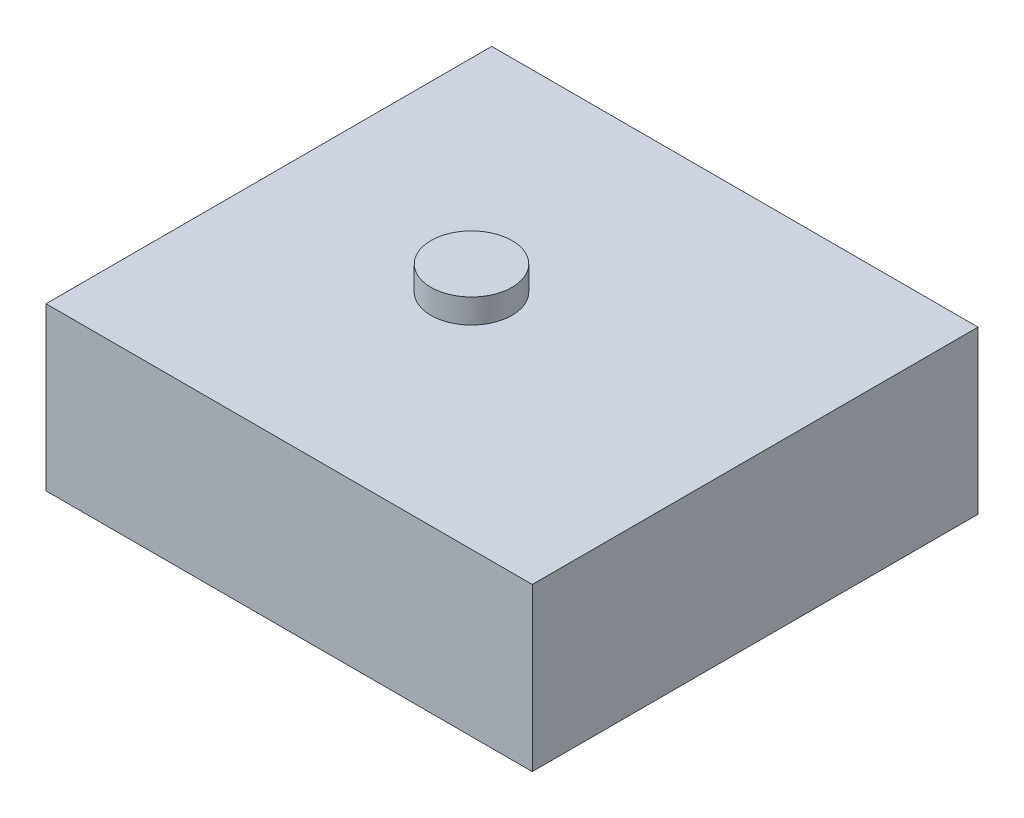
ISO-10303-21;
HEADER;
FILE_DESCRIPTION(('STEP AP214'),'2;1');
FILE_NAME('part.step','',(''),(''),'','','');
FILE_SCHEMA(('AUTOMOTIVE_DESIGN { 1 0 10303 214 1 1 1 1 }'));
ENDSEC;
DATA;
#1=APPLICATION_CONTEXT('core data for automotive mechanical design processes');
#2=APPLICATION_PROTOCOL_DEFINITION('international standard','automotive_design',2000,#1);
#3=PRODUCT_CONTEXT('',#1,'mechanical');
#4=PRODUCT('Part','Part','',(#3));
#5=PRODUCT_RELATED_PRODUCT_CATEGORY('part','',(#4));
#6=PRODUCT_DEFINITION_FORMATION('','',#4);
#7=PRODUCT_DEFINITION_CONTEXT('part definition',#1,'design');
#8=PRODUCT_DEFINITION('design','',#6,#7);
#9=PRODUCT_DEFINITION_SHAPE('','',#8);
#10=(LENGTH_UNIT() NAMED_UNIT(*) SI_UNIT(.MILLI.,.METRE.));
#11=(NAMED_UNIT(*) PLANE_ANGLE_UNIT() SI_UNIT($,.RADIAN.));
#12=(NAMED_UNIT(*) SI_UNIT($,.STERADIAN.) SOLID_ANGLE_UNIT());
#13=UNCERTAINTY_MEASURE_WITH_UNIT(LENGTH_MEASURE(1.E-05),#10,'distance_accuracy_value','');
#14=(GEOMETRIC_REPRESENTATION_CONTEXT(3) GLOBAL_UNCERTAINTY_ASSIGNED_CONTEXT((#13)) GLOBAL_UNIT_ASSIGNED_CONTEXT((#10,
#11,#12)) REPRESENTATION_CONTEXT('',''));
#15=CARTESIAN_POINT('',(0.,0.,0.));
#16=DIRECTION('',(0.,0.,1.));
#17=DIRECTION('',(1.,0.,0.));
#18=AXIS2_PLACEMENT_3D('',#15,#16,#17);
#19=CARTESIAN_POINT('',(60.,40.,-55.));
#20=DIRECTION('',(-1.,0.,0.));
#21=DIRECTION('',(0.,0.,1.));
#22=AXIS2_PLACEMENT_3D('',#19,#20,#21);
#23=PLANE('',#22);
#24=DIRECTION('',(0.,0.,-1.));
#25=VECTOR('',#24,1.);
#26=CARTESIAN_POINT('',(60.,0.,-55.));
#27=LINE('',#26,#25);
#28=CARTESIAN_POINT('',(60.,0.,55.));
#29=VERTEX_POINT('',#28);
#30=CARTESIAN_POINT('',(60.,0.,-55.));
#31=VERTEX_POINT('',#30);
#32=EDGE_CURVE('E100',#29,#31,#27,.T.);
#33=ORIENTED_EDGE('',*,*,#32,.T.);
#34=DIRECTION('',(0.,-1.,0.));
#35=VECTOR('',#34,1.);
#36=CARTESIAN_POINT('',(60.,40.,-55.));
#37=LINE('',#36,#35);
#38=CARTESIAN_POINT('',(60.,40.,-55.));
#39=VERTEX_POINT('',#38);
#40=EDGE_CURVE('E11',#39,#31,#37,.T.);
#41=ORIENTED_EDGE('',*,*,#40,.F.);
#42=DIRECTION('',(0.,0.,-1.));
#43=VECTOR('',#42,1.);
#44=CARTESIAN_POINT('',(60.,40.,-55.));
#45=LINE('',#44,#43);
#46=CARTESIAN_POINT('',(60.,40.,55.));
#47=VERTEX_POINT('',#46);
#48=EDGE_CURVE('E88',#47,#39,#45,.T.);
#49=ORIENTED_EDGE('',*,*,#48,.F.);
#50=DIRECTION('',(0.,-1.,0.));
#51=VECTOR('',#50,1.);
#52=CARTESIAN_POINT('',(60.,40.,55.));
#53=LINE('',#52,#51);
#54=EDGE_CURVE('E96',#47,#29,#53,.T.);
#55=ORIENTED_EDGE('',*,*,#54,.T.);
#56=EDGE_LOOP('',(#33,#41,#49,#55));
#57=FACE_BOUND('',#56,.T.);
#58=ADVANCED_FACE('F37',(#57),#23,.F.);
#59=CARTESIAN_POINT('',(-60.,40.,-55.));
#60=DIRECTION('',(0.,0.,1.));
#61=DIRECTION('',(1.,0.,0.));
#62=AXIS2_PLACEMENT_3D('',#59,#60,#61);
#63=PLANE('',#62);
#64=DIRECTION('',(-1.,0.,0.));
#65=VECTOR('',#64,1.);
#66=CARTESIAN_POINT('',(-60.,0.,-55.));
#67=LINE('',#66,#65);
#68=CARTESIAN_POINT('',(-60.,0.,-55.));
#69=VERTEX_POINT('',#68);
#70=EDGE_CURVE('E92',#31,#69,#67,.T.);
#71=ORIENTED_EDGE('',*,*,#70,.T.);
#72=DIRECTION('',(0.,-1.,0.));
#73=VECTOR('',#72,1.);
#74=CARTESIAN_POINT('',(-60.,40.,-55.));
#75=LINE('',#74,#73);
#76=CARTESIAN_POINT('',(-60.,40.,-55.));
#77=VERTEX_POINT('',#76);
#78=EDGE_CURVE('E45',#77,#69,#75,.T.);
#79=ORIENTED_EDGE('',*,*,#78,.F.);
#80=DIRECTION('',(-1.,0.,0.));
#81=VECTOR('',#80,1.);
#82=CARTESIAN_POINT('',(-60.,40.,-55.));
#83=LINE('',#82,#81);
#84=EDGE_CURVE('E83',#39,#77,#83,.T.);
#85=ORIENTED_EDGE('',*,*,#84,.F.);
#86=ORIENTED_EDGE('',*,*,#40,.T.);
#87=EDGE_LOOP('',(#71,#79,#85,#86));
#88=FACE_BOUND('',#87,.T.);
#89=ADVANCED_FACE('F91',(#88),#63,.F.);
#90=CARTESIAN_POINT('',(-60.,40.,-55.));
#91=DIRECTION('',(1.,0.,0.));
#92=DIRECTION('',(0.,0.,-1.));
#93=AXIS2_PLACEMENT_3D('',#90,#91,#92);
#94=PLANE('',#93);
#95=DIRECTION('',(0.,0.,1.));
#96=VECTOR('',#95,1.);
#97=CARTESIAN_POINT('',(-60.,0.,-55.));
#98=LINE('',#97,#96);
#99=CARTESIAN_POINT('',(-60.,0.,55.));
#100=VERTEX_POINT('',#99);
#101=EDGE_CURVE('E70',#69,#100,#98,.T.);
#102=ORIENTED_EDGE('',*,*,#101,.T.);
#103=DIRECTION('',(0.,-1.,0.));
#104=VECTOR('',#103,1.);
#105=CARTESIAN_POINT('',(-60.,40.,55.));
#106=LINE('',#105,#104);
#107=CARTESIAN_POINT('',(-60.,40.,55.));
#108=VERTEX_POINT('',#107);
#109=EDGE_CURVE('E93',#108,#100,#106,.T.);
#110=ORIENTED_EDGE('',*,*,#109,.F.);
#111=DIRECTION('',(0.,0.,1.));
#112=VECTOR('',#111,1.);
#113=CARTESIAN_POINT('',(-60.,40.,-55.));
#114=LINE('',#113,#112);
#115=EDGE_CURVE('E86',#77,#108,#114,.T.);
#116=ORIENTED_EDGE('',*,*,#115,.F.);
#117=ORIENTED_EDGE('',*,*,#78,.T.);
#118=EDGE_LOOP('',(#102,#110,#116,#117));
#119=FACE_BOUND('',#118,.T.);
#120=ADVANCED_FACE('F94',(#119),#94,.F.);
#121=CARTESIAN_POINT('',(-60.,40.,55.));
#122=DIRECTION('',(0.,0.,-1.));
#123=DIRECTION('',(-1.,0.,0.));
#124=AXIS2_PLACEMENT_3D('',#121,#122,#123);
#125=PLANE('',#124);
#126=DIRECTION('',(1.,0.,0.));
#127=VECTOR('',#126,1.);
#128=CARTESIAN_POINT('',(-60.,0.,55.));
#129=LINE('',#128,#127);
#130=EDGE_CURVE('E76',#100,#29,#129,.T.);
#131=ORIENTED_EDGE('',*,*,#130,.T.);
#132=ORIENTED_EDGE('',*,*,#54,.F.);
#133=DIRECTION('',(1.,0.,0.));
#134=VECTOR('',#133,1.);
#135=CARTESIAN_POINT('',(-60.,40.,55.));
#136=LINE('',#135,#134);
#137=EDGE_CURVE('E53',#108,#47,#136,.T.);
#138=ORIENTED_EDGE('',*,*,#137,.F.);
#139=ORIENTED_EDGE('',*,*,#109,.T.);
#140=EDGE_LOOP('',(#131,#132,#138,#139));
#141=FACE_BOUND('',#140,.T.);
#142=ADVANCED_FACE('F108',(#141),#125,.F.);
#143=CARTESIAN_POINT('',(0.,40.,0.));
#144=DIRECTION('',(0.,1.,0.));
#145=DIRECTION('',(0.,0.,1.));
#146=AXIS2_PLACEMENT_3D('',#143,#144,#145);
#147=PLANE('',#146);
#148=CARTESIAN_POINT('',(-10.,40.,0.));
#149=DIRECTION('',(0.,1.,0.));
#150=DIRECTION('',(0.,0.,1.));
#151=AXIS2_PLACEMENT_3D('',#148,#149,#150);
#152=CIRCLE('',#151,10.);
#153=CARTESIAN_POINT('',(-10.,40.,10.));
#154=VERTEX_POINT('',#153);
#155=EDGE_CURVE('E114',#154,#154,#152,.T.);
#156=ORIENTED_EDGE('',*,*,#155,.F.);
#157=EDGE_LOOP('',(#156));
#158=FACE_BOUND('',#157,.T.);
#159=ORIENTED_EDGE('',*,*,#48,.T.);
#160=ORIENTED_EDGE('',*,*,#84,.T.);
#161=ORIENTED_EDGE('',*,*,#115,.T.);
#162=ORIENTED_EDGE('',*,*,#137,.T.);
#163=EDGE_LOOP('',(#159,#160,#161,#162));
#164=FACE_BOUND('',#163,.T.);
#165=ADVANCED_FACE('F84',(#158,#164),#147,.T.);
#166=CARTESIAN_POINT('',(0.,0.,0.));
#167=DIRECTION('',(0.,1.,0.));
#168=DIRECTION('',(0.,0.,1.));
#169=AXIS2_PLACEMENT_3D('',#166,#167,#168);
#170=PLANE('',#169);
#171=ORIENTED_EDGE('',*,*,#32,.F.);
#172=ORIENTED_EDGE('',*,*,#130,.F.);
#173=ORIENTED_EDGE('',*,*,#101,.F.);
#174=ORIENTED_EDGE('',*,*,#70,.F.);
#175=EDGE_LOOP('',(#171,#172,#173,#174));
#176=FACE_BOUND('',#175,.T.);
#177=ADVANCED_FACE('F111',(#176),#170,.F.);
#178=CARTESIAN_POINT('',(-10.,46.,0.));
#179=DIRECTION('',(0.,-1.,0.));
#180=DIRECTION('',(0.,0.,-1.));
#181=AXIS2_PLACEMENT_3D('',#178,#179,#180);
#182=CYLINDRICAL_SURFACE('',#181,10.);
#183=CARTESIAN_POINT('',(-10.,46.,0.));
#184=DIRECTION('',(0.,1.,0.));
#185=DIRECTION('',(0.,0.,1.));
#186=AXIS2_PLACEMENT_3D('',#183,#184,#185);
#187=CIRCLE('',#186,10.);
#188=CARTESIAN_POINT('',(-10.,46.,10.));
#189=VERTEX_POINT('',#188);
#190=EDGE_CURVE('E103',#189,#189,#187,.T.);
#191=ORIENTED_EDGE('',*,*,#190,.F.);
#192=EDGE_LOOP('',(#191));
#193=FACE_BOUND('',#192,.T.);
#194=ORIENTED_EDGE('',*,*,#155,.T.);
#195=EDGE_LOOP('',(#194));
#196=FACE_BOUND('',#195,.T.);
#197=ADVANCED_FACE('F122',(#193,#196),#182,.T.);
#198=CARTESIAN_POINT('',(-10.,46.,0.));
#199=DIRECTION('',(0.,1.,0.));
#200=DIRECTION('',(0.,0.,1.));
#201=AXIS2_PLACEMENT_3D('',#198,#199,#200);
#202=PLANE('',#201);
#203=ORIENTED_EDGE('',*,*,#190,.T.);
#204=EDGE_LOOP('',(#203));
#205=FACE_BOUND('',#204,.T.);
#206=ADVANCED_FACE('F120',(#205),#202,.T.);
#207=CLOSED_SHELL('',(#58,#89,#120,#142,#165,#177,#197,#206));
#208=MANIFOLD_SOLID_BREP('B2',#207);
#209=ADVANCED_BREP_SHAPE_REPRESENTATION('',(#18,#208),#14);
#210=SHAPE_DEFINITION_REPRESENTATION(#9,#209);
ENDSEC;
END-ISO-10303-21;
